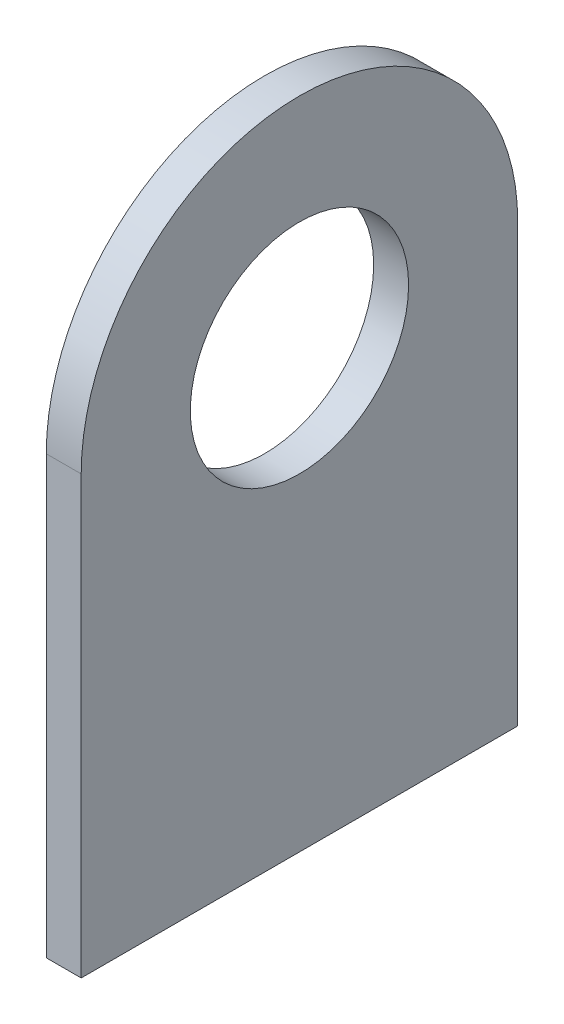
ISO-10303-21;
HEADER;
FILE_DESCRIPTION(('STEP AP214'),'2;1');
FILE_NAME('part.step','',(''),(''),'','','');
FILE_SCHEMA(('AUTOMOTIVE_DESIGN { 1 0 10303 214 1 1 1 1 }'));
ENDSEC;
DATA;
#1=APPLICATION_CONTEXT('core data for automotive mechanical design processes');
#2=APPLICATION_PROTOCOL_DEFINITION('international standard','automotive_design',2000,#1);
#3=PRODUCT_CONTEXT('',#1,'mechanical');
#4=PRODUCT('Part','Part','',(#3));
#5=PRODUCT_RELATED_PRODUCT_CATEGORY('part','',(#4));
#6=PRODUCT_DEFINITION_FORMATION('','',#4);
#7=PRODUCT_DEFINITION_CONTEXT('part definition',#1,'design');
#8=PRODUCT_DEFINITION('design','',#6,#7);
#9=PRODUCT_DEFINITION_SHAPE('','',#8);
#10=(LENGTH_UNIT() NAMED_UNIT(*) SI_UNIT(.MILLI.,.METRE.));
#11=(NAMED_UNIT(*) PLANE_ANGLE_UNIT() SI_UNIT($,.RADIAN.));
#12=(NAMED_UNIT(*) SI_UNIT($,.STERADIAN.) SOLID_ANGLE_UNIT());
#13=UNCERTAINTY_MEASURE_WITH_UNIT(LENGTH_MEASURE(1.E-05),#10,'distance_accuracy_value','');
#14=(GEOMETRIC_REPRESENTATION_CONTEXT(3) GLOBAL_UNCERTAINTY_ASSIGNED_CONTEXT((#13)) GLOBAL_UNIT_ASSIGNED_CONTEXT((#10,
#11,#12)) REPRESENTATION_CONTEXT('',''));
#15=CARTESIAN_POINT('',(0.,0.,0.));
#16=DIRECTION('',(0.,0.,1.));
#17=DIRECTION('',(1.,0.,0.));
#18=AXIS2_PLACEMENT_3D('',#15,#16,#17);
#19=CARTESIAN_POINT('',(4.00000000000311,100.,0.));
#20=DIRECTION('',(1.,0.,0.));
#21=DIRECTION('',(0.,0.,-1.));
#22=AXIS2_PLACEMENT_3D('',#19,#20,#21);
#23=PLANE('',#22);
#24=CARTESIAN_POINT('',(4.00000000000311,100.,0.));
#25=DIRECTION('',(1.,0.,0.));
#26=DIRECTION('',(0.,0.,-1.));
#27=AXIS2_PLACEMENT_3D('',#24,#25,#26);
#28=CIRCLE('',#27,50.);
#29=CARTESIAN_POINT('',(4.00000000000311,100.,-49.9999999999998));
#30=VERTEX_POINT('',#29);
#31=CARTESIAN_POINT('',(4.00000000000245,100.,49.9999999999998));
#32=VERTEX_POINT('',#31);
#33=EDGE_CURVE('E84',#30,#32,#28,.T.);
#34=ORIENTED_EDGE('',*,*,#33,.T.);
#35=DIRECTION('',(0.,-1.,0.));
#36=VECTOR('',#35,1.);
#37=CARTESIAN_POINT('',(3.99999999999934,0.,49.9999999999998));
#38=LINE('',#37,#36);
#39=CARTESIAN_POINT('',(3.99999999999934,0.,49.9999999999998));
#40=VERTEX_POINT('',#39);
#41=EDGE_CURVE('E79',#32,#40,#38,.T.);
#42=ORIENTED_EDGE('',*,*,#41,.T.);
#43=DIRECTION('',(0.,0.,-1.));
#44=VECTOR('',#43,1.);
#45=CARTESIAN_POINT('',(3.99999999999934,0.,49.9999999999998));
#46=LINE('',#45,#44);
#47=CARTESIAN_POINT('',(4.,0.,-49.9999999999998));
#48=VERTEX_POINT('',#47);
#49=EDGE_CURVE('E82',#40,#48,#46,.T.);
#50=ORIENTED_EDGE('',*,*,#49,.T.);
#51=DIRECTION('',(0.,1.,0.));
#52=VECTOR('',#51,1.);
#53=CARTESIAN_POINT('',(4.,0.,-49.9999999999998));
#54=LINE('',#53,#52);
#55=EDGE_CURVE('E49',#48,#30,#54,.T.);
#56=ORIENTED_EDGE('',*,*,#55,.T.);
#57=EDGE_LOOP('',(#34,#42,#50,#56));
#58=FACE_BOUND('',#57,.T.);
#59=CARTESIAN_POINT('',(4.00000000000311,100.,0.));
#60=DIRECTION('',(1.,0.,0.));
#61=DIRECTION('',(0.,0.,-1.));
#62=AXIS2_PLACEMENT_3D('',#59,#60,#61);
#63=CIRCLE('',#62,25.);
#64=CARTESIAN_POINT('',(4.00000000000311,100.,-25.));
#65=VERTEX_POINT('',#64);
#66=EDGE_CURVE('E99',#65,#65,#63,.T.);
#67=ORIENTED_EDGE('',*,*,#66,.F.);
#68=EDGE_LOOP('',(#67));
#69=FACE_BOUND('',#68,.T.);
#70=ADVANCED_FACE('F32',(#58,#69),#23,.T.);
#71=CARTESIAN_POINT('',(-3.99999999999689,100.,0.));
#72=DIRECTION('',(1.,0.,0.));
#73=DIRECTION('',(0.,0.,-1.));
#74=AXIS2_PLACEMENT_3D('',#71,#72,#73);
#75=PLANE('',#74);
#76=CARTESIAN_POINT('',(-3.99999999999689,100.,0.));
#77=DIRECTION('',(1.,0.,0.));
#78=DIRECTION('',(0.,0.,-1.));
#79=AXIS2_PLACEMENT_3D('',#76,#77,#78);
#80=CIRCLE('',#79,50.);
#81=CARTESIAN_POINT('',(-3.99999999999689,100.,-49.9999999999998));
#82=VERTEX_POINT('',#81);
#83=CARTESIAN_POINT('',(-3.99999999999756,100.,49.9999999999998));
#84=VERTEX_POINT('',#83);
#85=EDGE_CURVE('E96',#82,#84,#80,.T.);
#86=ORIENTED_EDGE('',*,*,#85,.F.);
#87=DIRECTION('',(0.,1.,0.));
#88=VECTOR('',#87,1.);
#89=CARTESIAN_POINT('',(-4.,0.,-49.9999999999998));
#90=LINE('',#89,#88);
#91=CARTESIAN_POINT('',(-4.,0.,-49.9999999999998));
#92=VERTEX_POINT('',#91);
#93=EDGE_CURVE('E72',#92,#82,#90,.T.);
#94=ORIENTED_EDGE('',*,*,#93,.F.);
#95=DIRECTION('',(0.,0.,-1.));
#96=VECTOR('',#95,1.);
#97=CARTESIAN_POINT('',(-4.00000000000067,0.,49.9999999999998));
#98=LINE('',#97,#96);
#99=CARTESIAN_POINT('',(-4.00000000000067,0.,49.9999999999998));
#100=VERTEX_POINT('',#99);
#101=EDGE_CURVE('E66',#100,#92,#98,.T.);
#102=ORIENTED_EDGE('',*,*,#101,.F.);
#103=DIRECTION('',(0.,-1.,0.));
#104=VECTOR('',#103,1.);
#105=CARTESIAN_POINT('',(-4.00000000000067,0.,49.9999999999998));
#106=LINE('',#105,#104);
#107=EDGE_CURVE('E88',#84,#100,#106,.T.);
#108=ORIENTED_EDGE('',*,*,#107,.F.);
#109=EDGE_LOOP('',(#86,#94,#102,#108));
#110=FACE_BOUND('',#109,.T.);
#111=CARTESIAN_POINT('',(-3.99999999999689,100.,0.));
#112=DIRECTION('',(1.,0.,0.));
#113=DIRECTION('',(0.,0.,-1.));
#114=AXIS2_PLACEMENT_3D('',#111,#112,#113);
#115=CIRCLE('',#114,25.);
#116=CARTESIAN_POINT('',(-3.99999999999689,100.,-25.));
#117=VERTEX_POINT('',#116);
#118=EDGE_CURVE('E111',#117,#117,#115,.T.);
#119=ORIENTED_EDGE('',*,*,#118,.T.);
#120=EDGE_LOOP('',(#119));
#121=FACE_BOUND('',#120,.T.);
#122=ADVANCED_FACE('F107',(#110,#121),#75,.F.);
#123=CARTESIAN_POINT('',(4.00000000000311,100.,0.));
#124=DIRECTION('',(-1.,0.,0.));
#125=DIRECTION('',(0.,0.,1.));
#126=AXIS2_PLACEMENT_3D('',#123,#124,#125);
#127=CYLINDRICAL_SURFACE('',#126,50.);
#128=ORIENTED_EDGE('',*,*,#85,.T.);
#129=DIRECTION('',(-1.,0.,0.));
#130=VECTOR('',#129,1.);
#131=CARTESIAN_POINT('',(4.00000000000245,100.,49.9999999999998));
#132=LINE('',#131,#130);
#133=EDGE_CURVE('E11',#32,#84,#132,.T.);
#134=ORIENTED_EDGE('',*,*,#133,.F.);
#135=ORIENTED_EDGE('',*,*,#33,.F.);
#136=DIRECTION('',(-1.,0.,0.));
#137=VECTOR('',#136,1.);
#138=CARTESIAN_POINT('',(4.00000000000311,100.,-49.9999999999998));
#139=LINE('',#138,#137);
#140=EDGE_CURVE('E92',#30,#82,#139,.T.);
#141=ORIENTED_EDGE('',*,*,#140,.T.);
#142=EDGE_LOOP('',(#128,#134,#135,#141));
#143=FACE_BOUND('',#142,.T.);
#144=ADVANCED_FACE('F34',(#143),#127,.T.);
#145=CARTESIAN_POINT('',(3.99999999999934,0.,49.9999999999998));
#146=DIRECTION('',(0.,0.,-1.));
#147=DIRECTION('',(-1.,0.,0.));
#148=AXIS2_PLACEMENT_3D('',#145,#146,#147);
#149=PLANE('',#148);
#150=ORIENTED_EDGE('',*,*,#107,.T.);
#151=DIRECTION('',(-1.,0.,0.));
#152=VECTOR('',#151,1.);
#153=CARTESIAN_POINT('',(3.99999999999934,0.,49.9999999999998));
#154=LINE('',#153,#152);
#155=EDGE_CURVE('E41',#40,#100,#154,.T.);
#156=ORIENTED_EDGE('',*,*,#155,.F.);
#157=ORIENTED_EDGE('',*,*,#41,.F.);
#158=ORIENTED_EDGE('',*,*,#133,.T.);
#159=EDGE_LOOP('',(#150,#156,#157,#158));
#160=FACE_BOUND('',#159,.T.);
#161=ADVANCED_FACE('F87',(#160),#149,.F.);
#162=CARTESIAN_POINT('',(3.99999999999934,0.,49.9999999999998));
#163=DIRECTION('',(0.,1.,0.));
#164=DIRECTION('',(0.,0.,1.));
#165=AXIS2_PLACEMENT_3D('',#162,#163,#164);
#166=PLANE('',#165);
#167=ORIENTED_EDGE('',*,*,#101,.T.);
#168=DIRECTION('',(-1.,0.,0.));
#169=VECTOR('',#168,1.);
#170=CARTESIAN_POINT('',(4.,0.,-49.9999999999998));
#171=LINE('',#170,#169);
#172=EDGE_CURVE('E89',#48,#92,#171,.T.);
#173=ORIENTED_EDGE('',*,*,#172,.F.);
#174=ORIENTED_EDGE('',*,*,#49,.F.);
#175=ORIENTED_EDGE('',*,*,#155,.T.);
#176=EDGE_LOOP('',(#167,#173,#174,#175));
#177=FACE_BOUND('',#176,.T.);
#178=ADVANCED_FACE('F90',(#177),#166,.F.);
#179=CARTESIAN_POINT('',(4.,0.,-49.9999999999998));
#180=DIRECTION('',(0.,0.,1.));
#181=DIRECTION('',(1.,0.,0.));
#182=AXIS2_PLACEMENT_3D('',#179,#180,#181);
#183=PLANE('',#182);
#184=ORIENTED_EDGE('',*,*,#93,.T.);
#185=ORIENTED_EDGE('',*,*,#140,.F.);
#186=ORIENTED_EDGE('',*,*,#55,.F.);
#187=ORIENTED_EDGE('',*,*,#172,.T.);
#188=EDGE_LOOP('',(#184,#185,#186,#187));
#189=FACE_BOUND('',#188,.T.);
#190=ADVANCED_FACE('F104',(#189),#183,.F.);
#191=CARTESIAN_POINT('',(4.00000000000311,100.,0.));
#192=DIRECTION('',(-1.,0.,0.));
#193=DIRECTION('',(0.,0.,1.));
#194=AXIS2_PLACEMENT_3D('',#191,#192,#193);
#195=CYLINDRICAL_SURFACE('',#194,25.);
#196=ORIENTED_EDGE('',*,*,#66,.T.);
#197=EDGE_LOOP('',(#196));
#198=FACE_BOUND('',#197,.T.);
#199=ORIENTED_EDGE('',*,*,#118,.F.);
#200=EDGE_LOOP('',(#199));
#201=FACE_BOUND('',#200,.T.);
#202=ADVANCED_FACE('F117',(#198,#201),#195,.F.);
#203=CLOSED_SHELL('',(#70,#122,#144,#161,#178,#190,#202));
#204=MANIFOLD_SOLID_BREP('B2',#203);
#205=ADVANCED_BREP_SHAPE_REPRESENTATION('',(#18,#204),#14);
#206=SHAPE_DEFINITION_REPRESENTATION(#9,#205);
ENDSEC;
END-ISO-10303-21;
